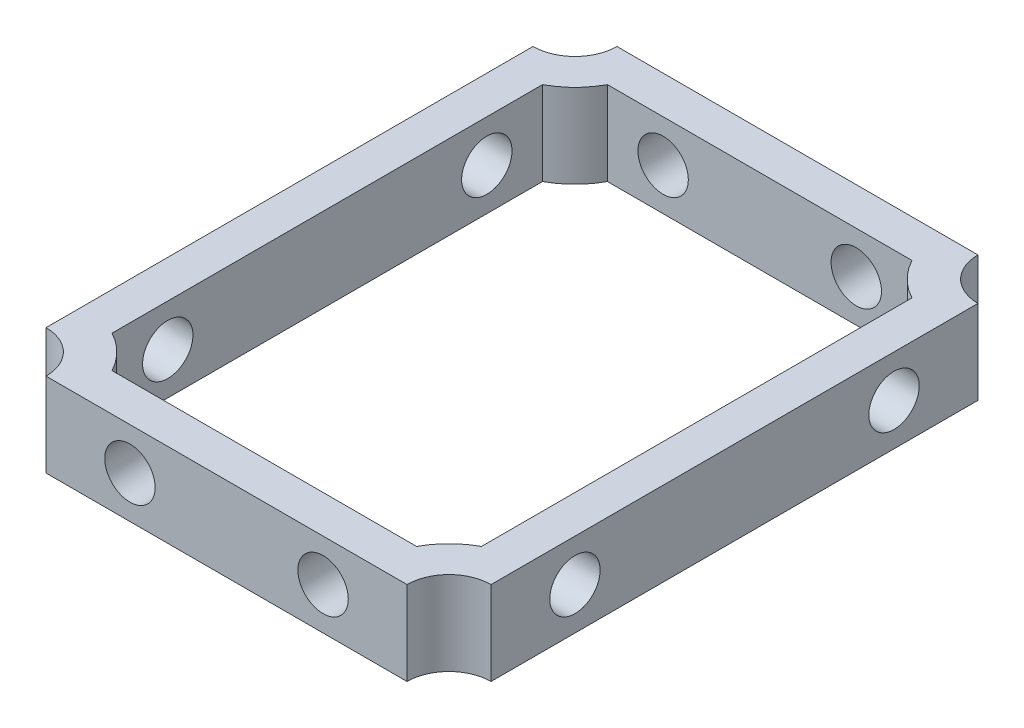
ISO-10303-21;
HEADER;
FILE_DESCRIPTION(('STEP AP214'),'2;1');
FILE_NAME('part.step','',(''),(''),'','','');
FILE_SCHEMA(('AUTOMOTIVE_DESIGN { 1 0 10303 214 1 1 1 1 }'));
ENDSEC;
DATA;
#1=APPLICATION_CONTEXT('core data for automotive mechanical design processes');
#2=APPLICATION_PROTOCOL_DEFINITION('international standard','automotive_design',2000,#1);
#3=PRODUCT_CONTEXT('',#1,'mechanical');
#4=PRODUCT('Part','Part','',(#3));
#5=PRODUCT_RELATED_PRODUCT_CATEGORY('part','',(#4));
#6=PRODUCT_DEFINITION_FORMATION('','',#4);
#7=PRODUCT_DEFINITION_CONTEXT('part definition',#1,'design');
#8=PRODUCT_DEFINITION('design','',#6,#7);
#9=PRODUCT_DEFINITION_SHAPE('','',#8);
#10=(LENGTH_UNIT() NAMED_UNIT(*) SI_UNIT(.MILLI.,.METRE.));
#11=(NAMED_UNIT(*) PLANE_ANGLE_UNIT() SI_UNIT($,.RADIAN.));
#12=(NAMED_UNIT(*) SI_UNIT($,.STERADIAN.) SOLID_ANGLE_UNIT());
#13=UNCERTAINTY_MEASURE_WITH_UNIT(LENGTH_MEASURE(1.E-05),#10,'distance_accuracy_value','');
#14=(GEOMETRIC_REPRESENTATION_CONTEXT(3) GLOBAL_UNCERTAINTY_ASSIGNED_CONTEXT((#13)) GLOBAL_UNIT_ASSIGNED_CONTEXT((#10,
#11,#12)) REPRESENTATION_CONTEXT('',''));
#15=CARTESIAN_POINT('',(0.,0.,0.));
#16=DIRECTION('',(0.,0.,1.));
#17=DIRECTION('',(1.,0.,0.));
#18=AXIS2_PLACEMENT_3D('',#15,#16,#17);
#19=CARTESIAN_POINT('',(-26.5,10.,-34.));
#20=DIRECTION('',(0.,1.,0.));
#21=DIRECTION('',(0.,0.,1.));
#22=AXIS2_PLACEMENT_3D('',#19,#20,#21);
#23=PLANE('',#22);
#24=CARTESIAN_POINT('',(-26.5,10.,-34.));
#25=DIRECTION('',(0.,-1.,0.));
#26=DIRECTION('',(0.,0.,1.));
#27=AXIS2_PLACEMENT_3D('',#24,#25,#26);
#28=CIRCLE('',#27,5.);
#29=CARTESIAN_POINT('',(-21.5,10.,-34.));
#30=VERTEX_POINT('',#29);
#31=CARTESIAN_POINT('',(-26.5,10.,-29.));
#32=VERTEX_POINT('',#31);
#33=EDGE_CURVE('E251',#30,#32,#28,.T.);
#34=ORIENTED_EDGE('',*,*,#33,.T.);
#35=DIRECTION('',(0.,0.,1.));
#36=VECTOR('',#35,1.);
#37=CARTESIAN_POINT('',(-26.5,10.,-29.));
#38=LINE('',#37,#36);
#39=CARTESIAN_POINT('',(-26.5,10.,29.));
#40=VERTEX_POINT('',#39);
#41=EDGE_CURVE('E255',#32,#40,#38,.T.);
#42=ORIENTED_EDGE('',*,*,#41,.T.);
#43=CARTESIAN_POINT('',(-26.5,10.,34.));
#44=DIRECTION('',(0.,-1.,0.));
#45=DIRECTION('',(0.,0.,1.));
#46=AXIS2_PLACEMENT_3D('',#43,#44,#45);
#47=CIRCLE('',#46,5.);
#48=CARTESIAN_POINT('',(-21.5,10.,34.));
#49=VERTEX_POINT('',#48);
#50=EDGE_CURVE('E259',#40,#49,#47,.T.);
#51=ORIENTED_EDGE('',*,*,#50,.T.);
#52=DIRECTION('',(1.,0.,0.));
#53=VECTOR('',#52,1.);
#54=CARTESIAN_POINT('',(-21.5,10.,34.));
#55=LINE('',#54,#53);
#56=CARTESIAN_POINT('',(21.5,10.,34.));
#57=VERTEX_POINT('',#56);
#58=EDGE_CURVE('E262',#49,#57,#55,.T.);
#59=ORIENTED_EDGE('',*,*,#58,.T.);
#60=CARTESIAN_POINT('',(26.5,10.,34.));
#61=DIRECTION('',(0.,-1.,0.));
#62=DIRECTION('',(0.,0.,1.));
#63=AXIS2_PLACEMENT_3D('',#60,#61,#62);
#64=CIRCLE('',#63,5.);
#65=CARTESIAN_POINT('',(26.5,10.,29.));
#66=VERTEX_POINT('',#65);
#67=EDGE_CURVE('E265',#57,#66,#64,.T.);
#68=ORIENTED_EDGE('',*,*,#67,.T.);
#69=DIRECTION('',(0.,0.,-1.));
#70=VECTOR('',#69,1.);
#71=CARTESIAN_POINT('',(26.5,10.,-29.));
#72=LINE('',#71,#70);
#73=CARTESIAN_POINT('',(26.5,10.,-29.));
#74=VERTEX_POINT('',#73);
#75=EDGE_CURVE('E268',#66,#74,#72,.T.);
#76=ORIENTED_EDGE('',*,*,#75,.T.);
#77=CARTESIAN_POINT('',(26.5,10.,-34.));
#78=DIRECTION('',(0.,-1.,0.));
#79=DIRECTION('',(0.,0.,1.));
#80=AXIS2_PLACEMENT_3D('',#77,#78,#79);
#81=CIRCLE('',#80,5.);
#82=CARTESIAN_POINT('',(21.5,10.,-34.));
#83=VERTEX_POINT('',#82);
#84=EDGE_CURVE('E271',#74,#83,#81,.T.);
#85=ORIENTED_EDGE('',*,*,#84,.T.);
#86=DIRECTION('',(-1.,0.,0.));
#87=VECTOR('',#86,1.);
#88=CARTESIAN_POINT('',(-21.5,10.,-34.));
#89=LINE('',#88,#87);
#90=EDGE_CURVE('E274',#83,#30,#89,.T.);
#91=ORIENTED_EDGE('',*,*,#90,.T.);
#92=EDGE_LOOP('',(#34,#42,#51,#59,#68,#76,#85,#91));
#93=FACE_BOUND('',#92,.T.);
#94=DIRECTION('',(0.,0.,1.));
#95=VECTOR('',#94,1.);
#96=CARTESIAN_POINT('',(-22.,10.,-25.6333997346592));
#97=LINE('',#96,#95);
#98=CARTESIAN_POINT('',(-22.,10.,-25.6333997346592));
#99=VERTEX_POINT('',#98);
#100=CARTESIAN_POINT('',(-22.,10.,25.6333997346592));
#101=VERTEX_POINT('',#100);
#102=EDGE_CURVE('E169',#99,#101,#97,.T.);
#103=ORIENTED_EDGE('',*,*,#102,.F.);
#104=CARTESIAN_POINT('',(-26.5,10.,-34.));
#105=DIRECTION('',(0.,-1.,0.));
#106=DIRECTION('',(0.,0.,1.));
#107=AXIS2_PLACEMENT_3D('',#104,#105,#106);
#108=CIRCLE('',#107,9.5);
#109=CARTESIAN_POINT('',(-18.1333997346592,10.,-29.5));
#110=VERTEX_POINT('',#109);
#111=EDGE_CURVE('E160',#110,#99,#108,.T.);
#112=ORIENTED_EDGE('',*,*,#111,.F.);
#113=DIRECTION('',(-1.,0.,0.));
#114=VECTOR('',#113,1.);
#115=CARTESIAN_POINT('',(-18.1333997346592,10.,-29.5));
#116=LINE('',#115,#114);
#117=CARTESIAN_POINT('',(18.1333997346592,10.,-29.5));
#118=VERTEX_POINT('',#117);
#119=EDGE_CURVE('E202',#118,#110,#116,.T.);
#120=ORIENTED_EDGE('',*,*,#119,.F.);
#121=CARTESIAN_POINT('',(26.5,10.,-34.));
#122=DIRECTION('',(0.,-1.,0.));
#123=DIRECTION('',(0.,0.,1.));
#124=AXIS2_PLACEMENT_3D('',#121,#122,#123);
#125=CIRCLE('',#124,9.5);
#126=CARTESIAN_POINT('',(22.,10.,-25.6333997346592));
#127=VERTEX_POINT('',#126);
#128=EDGE_CURVE('E199',#127,#118,#125,.T.);
#129=ORIENTED_EDGE('',*,*,#128,.F.);
#130=DIRECTION('',(0.,0.,-1.));
#131=VECTOR('',#130,1.);
#132=CARTESIAN_POINT('',(22.,10.,-25.6333997346592));
#133=LINE('',#132,#131);
#134=CARTESIAN_POINT('',(22.,10.,25.6333997346592));
#135=VERTEX_POINT('',#134);
#136=EDGE_CURVE('E196',#135,#127,#133,.T.);
#137=ORIENTED_EDGE('',*,*,#136,.F.);
#138=CARTESIAN_POINT('',(26.5,10.,34.));
#139=DIRECTION('',(0.,-1.,0.));
#140=DIRECTION('',(0.,0.,1.));
#141=AXIS2_PLACEMENT_3D('',#138,#139,#140);
#142=CIRCLE('',#141,9.5);
#143=CARTESIAN_POINT('',(18.1333997346592,10.,29.5));
#144=VERTEX_POINT('',#143);
#145=EDGE_CURVE('E193',#144,#135,#142,.T.);
#146=ORIENTED_EDGE('',*,*,#145,.F.);
#147=DIRECTION('',(1.,0.,0.));
#148=VECTOR('',#147,1.);
#149=CARTESIAN_POINT('',(-18.1333997346592,10.,29.5));
#150=LINE('',#149,#148);
#151=CARTESIAN_POINT('',(-18.1333997346592,10.,29.5));
#152=VERTEX_POINT('',#151);
#153=EDGE_CURVE('E187',#152,#144,#150,.T.);
#154=ORIENTED_EDGE('',*,*,#153,.F.);
#155=CARTESIAN_POINT('',(-26.5,10.,34.));
#156=DIRECTION('',(0.,-1.,0.));
#157=DIRECTION('',(0.,0.,1.));
#158=AXIS2_PLACEMENT_3D('',#155,#156,#157);
#159=CIRCLE('',#158,9.5);
#160=EDGE_CURVE('E183',#101,#152,#159,.T.);
#161=ORIENTED_EDGE('',*,*,#160,.F.);
#162=EDGE_LOOP('',(#103,#112,#120,#129,#137,#146,#154,#161));
#163=FACE_BOUND('',#162,.T.);
#164=ADVANCED_FACE('F44',(#93,#163),#23,.T.);
#165=CARTESIAN_POINT('',(-26.5,0.,-34.));
#166=DIRECTION('',(0.,1.,0.));
#167=DIRECTION('',(0.,0.,1.));
#168=AXIS2_PLACEMENT_3D('',#165,#166,#167);
#169=PLANE('',#168);
#170=CARTESIAN_POINT('',(-26.5,0.,-34.));
#171=DIRECTION('',(0.,-1.,0.));
#172=DIRECTION('',(0.,0.,1.));
#173=AXIS2_PLACEMENT_3D('',#170,#171,#172);
#174=CIRCLE('',#173,5.);
#175=CARTESIAN_POINT('',(-21.5,0.,-34.));
#176=VERTEX_POINT('',#175);
#177=CARTESIAN_POINT('',(-26.5,0.,-29.));
#178=VERTEX_POINT('',#177);
#179=EDGE_CURVE('E178',#176,#178,#174,.T.);
#180=ORIENTED_EDGE('',*,*,#179,.F.);
#181=DIRECTION('',(-1.,0.,0.));
#182=VECTOR('',#181,1.);
#183=CARTESIAN_POINT('',(-21.5,0.,-34.));
#184=LINE('',#183,#182);
#185=CARTESIAN_POINT('',(21.5,0.,-34.));
#186=VERTEX_POINT('',#185);
#187=EDGE_CURVE('E256',#186,#176,#184,.T.);
#188=ORIENTED_EDGE('',*,*,#187,.F.);
#189=CARTESIAN_POINT('',(26.5,0.,-34.));
#190=DIRECTION('',(0.,-1.,0.));
#191=DIRECTION('',(0.,0.,1.));
#192=AXIS2_PLACEMENT_3D('',#189,#190,#191);
#193=CIRCLE('',#192,5.);
#194=CARTESIAN_POINT('',(26.5,0.,-29.));
#195=VERTEX_POINT('',#194);
#196=EDGE_CURVE('E296',#195,#186,#193,.T.);
#197=ORIENTED_EDGE('',*,*,#196,.F.);
#198=DIRECTION('',(0.,0.,-1.));
#199=VECTOR('',#198,1.);
#200=CARTESIAN_POINT('',(26.5,0.,-29.));
#201=LINE('',#200,#199);
#202=CARTESIAN_POINT('',(26.5,0.,29.));
#203=VERTEX_POINT('',#202);
#204=EDGE_CURVE('E293',#203,#195,#201,.T.);
#205=ORIENTED_EDGE('',*,*,#204,.F.);
#206=CARTESIAN_POINT('',(26.5,0.,34.));
#207=DIRECTION('',(0.,-1.,0.));
#208=DIRECTION('',(0.,0.,1.));
#209=AXIS2_PLACEMENT_3D('',#206,#207,#208);
#210=CIRCLE('',#209,5.);
#211=CARTESIAN_POINT('',(21.5,0.,34.));
#212=VERTEX_POINT('',#211);
#213=EDGE_CURVE('E290',#212,#203,#210,.T.);
#214=ORIENTED_EDGE('',*,*,#213,.F.);
#215=DIRECTION('',(1.,0.,0.));
#216=VECTOR('',#215,1.);
#217=CARTESIAN_POINT('',(-21.5,0.,34.));
#218=LINE('',#217,#216);
#219=CARTESIAN_POINT('',(-21.5,0.,34.));
#220=VERTEX_POINT('',#219);
#221=EDGE_CURVE('E287',#220,#212,#218,.T.);
#222=ORIENTED_EDGE('',*,*,#221,.F.);
#223=CARTESIAN_POINT('',(-26.5,0.,34.));
#224=DIRECTION('',(0.,-1.,0.));
#225=DIRECTION('',(0.,0.,1.));
#226=AXIS2_PLACEMENT_3D('',#223,#224,#225);
#227=CIRCLE('',#226,5.);
#228=CARTESIAN_POINT('',(-26.5,0.,29.));
#229=VERTEX_POINT('',#228);
#230=EDGE_CURVE('E284',#229,#220,#227,.T.);
#231=ORIENTED_EDGE('',*,*,#230,.F.);
#232=DIRECTION('',(0.,0.,1.));
#233=VECTOR('',#232,1.);
#234=CARTESIAN_POINT('',(-26.5,0.,-29.));
#235=LINE('',#234,#233);
#236=EDGE_CURVE('E281',#178,#229,#235,.T.);
#237=ORIENTED_EDGE('',*,*,#236,.F.);
#238=EDGE_LOOP('',(#180,#188,#197,#205,#214,#222,#231,#237));
#239=FACE_BOUND('',#238,.T.);
#240=CARTESIAN_POINT('',(-26.5,0.,-34.));
#241=DIRECTION('',(0.,-1.,0.));
#242=DIRECTION('',(0.,0.,1.));
#243=AXIS2_PLACEMENT_3D('',#240,#241,#242);
#244=CIRCLE('',#243,9.5);
#245=CARTESIAN_POINT('',(-18.1333997346592,0.,-29.5));
#246=VERTEX_POINT('',#245);
#247=CARTESIAN_POINT('',(-22.,0.,-25.6333997346592));
#248=VERTEX_POINT('',#247);
#249=EDGE_CURVE('E70',#246,#248,#244,.T.);
#250=ORIENTED_EDGE('',*,*,#249,.T.);
#251=DIRECTION('',(0.,0.,1.));
#252=VECTOR('',#251,1.);
#253=CARTESIAN_POINT('',(-22.,0.,-25.6333997346592));
#254=LINE('',#253,#252);
#255=CARTESIAN_POINT('',(-22.,0.,25.6333997346592));
#256=VERTEX_POINT('',#255);
#257=EDGE_CURVE('E176',#248,#256,#254,.T.);
#258=ORIENTED_EDGE('',*,*,#257,.T.);
#259=CARTESIAN_POINT('',(-26.5,0.,34.));
#260=DIRECTION('',(0.,-1.,0.));
#261=DIRECTION('',(0.,0.,1.));
#262=AXIS2_PLACEMENT_3D('',#259,#260,#261);
#263=CIRCLE('',#262,9.5);
#264=CARTESIAN_POINT('',(-18.1333997346592,0.,29.5));
#265=VERTEX_POINT('',#264);
#266=EDGE_CURVE('E210',#256,#265,#263,.T.);
#267=ORIENTED_EDGE('',*,*,#266,.T.);
#268=DIRECTION('',(1.,0.,0.));
#269=VECTOR('',#268,1.);
#270=CARTESIAN_POINT('',(-18.1333997346592,0.,29.5));
#271=LINE('',#270,#269);
#272=CARTESIAN_POINT('',(18.1333997346592,0.,29.5));
#273=VERTEX_POINT('',#272);
#274=EDGE_CURVE('E214',#265,#273,#271,.T.);
#275=ORIENTED_EDGE('',*,*,#274,.T.);
#276=CARTESIAN_POINT('',(26.5,0.,34.));
#277=DIRECTION('',(0.,-1.,0.));
#278=DIRECTION('',(0.,0.,1.));
#279=AXIS2_PLACEMENT_3D('',#276,#277,#278);
#280=CIRCLE('',#279,9.5);
#281=CARTESIAN_POINT('',(22.,0.,25.6333997346592));
#282=VERTEX_POINT('',#281);
#283=EDGE_CURVE('E218',#273,#282,#280,.T.);
#284=ORIENTED_EDGE('',*,*,#283,.T.);
#285=DIRECTION('',(0.,0.,-1.));
#286=VECTOR('',#285,1.);
#287=CARTESIAN_POINT('',(22.,0.,-25.6333997346592));
#288=LINE('',#287,#286);
#289=CARTESIAN_POINT('',(22.,0.,-25.6333997346592));
#290=VERTEX_POINT('',#289);
#291=EDGE_CURVE('E222',#282,#290,#288,.T.);
#292=ORIENTED_EDGE('',*,*,#291,.T.);
#293=CARTESIAN_POINT('',(26.5,0.,-34.));
#294=DIRECTION('',(0.,-1.,0.));
#295=DIRECTION('',(0.,0.,1.));
#296=AXIS2_PLACEMENT_3D('',#293,#294,#295);
#297=CIRCLE('',#296,9.5);
#298=CARTESIAN_POINT('',(18.1333997346592,0.,-29.5));
#299=VERTEX_POINT('',#298);
#300=EDGE_CURVE('E226',#290,#299,#297,.T.);
#301=ORIENTED_EDGE('',*,*,#300,.T.);
#302=DIRECTION('',(-1.,0.,0.));
#303=VECTOR('',#302,1.);
#304=CARTESIAN_POINT('',(-18.1333997346592,0.,-29.5));
#305=LINE('',#304,#303);
#306=EDGE_CURVE('E170',#299,#246,#305,.T.);
#307=ORIENTED_EDGE('',*,*,#306,.T.);
#308=EDGE_LOOP('',(#250,#258,#267,#275,#284,#292,#301,#307));
#309=FACE_BOUND('',#308,.T.);
#310=ADVANCED_FACE('F420',(#239,#309),#169,.F.);
#311=CARTESIAN_POINT('',(-26.5,10.,-34.));
#312=DIRECTION('',(0.,-1.,0.));
#313=DIRECTION('',(0.,0.,-1.));
#314=AXIS2_PLACEMENT_3D('',#311,#312,#313);
#315=CYLINDRICAL_SURFACE('',#314,5.);
#316=ORIENTED_EDGE('',*,*,#179,.T.);
#317=DIRECTION('',(0.,-1.,0.));
#318=VECTOR('',#317,1.);
#319=CARTESIAN_POINT('',(-26.5,10.,-29.));
#320=LINE('',#319,#318);
#321=EDGE_CURVE('E11',#32,#178,#320,.T.);
#322=ORIENTED_EDGE('',*,*,#321,.F.);
#323=ORIENTED_EDGE('',*,*,#33,.F.);
#324=DIRECTION('',(0.,-1.,0.));
#325=VECTOR('',#324,1.);
#326=CARTESIAN_POINT('',(-21.5,10.,-34.));
#327=LINE('',#326,#325);
#328=EDGE_CURVE('E277',#30,#176,#327,.T.);
#329=ORIENTED_EDGE('',*,*,#328,.T.);
#330=EDGE_LOOP('',(#316,#322,#323,#329));
#331=FACE_BOUND('',#330,.T.);
#332=ADVANCED_FACE('F46',(#331),#315,.F.);
#333=CARTESIAN_POINT('',(-26.5,10.,-29.));
#334=DIRECTION('',(1.,0.,0.));
#335=DIRECTION('',(0.,0.,-1.));
#336=AXIS2_PLACEMENT_3D('',#333,#334,#335);
#337=PLANE('',#336);
#338=CARTESIAN_POINT('',(-26.5,5.,19.));
#339=DIRECTION('',(1.,0.,0.));
#340=DIRECTION('',(0.,0.,-1.));
#341=AXIS2_PLACEMENT_3D('',#338,#339,#340);
#342=CIRCLE('',#341,3.);
#343=CARTESIAN_POINT('',(-26.5,5.,16.));
#344=VERTEX_POINT('',#343);
#345=EDGE_CURVE('E332',#344,#344,#342,.T.);
#346=ORIENTED_EDGE('',*,*,#345,.T.);
#347=EDGE_LOOP('',(#346));
#348=FACE_BOUND('',#347,.T.);
#349=CARTESIAN_POINT('',(-26.5,5.,-19.));
#350=DIRECTION('',(1.,0.,0.));
#351=DIRECTION('',(0.,0.,-1.));
#352=AXIS2_PLACEMENT_3D('',#349,#350,#351);
#353=CIRCLE('',#352,3.);
#354=CARTESIAN_POINT('',(-26.5,5.,-22.));
#355=VERTEX_POINT('',#354);
#356=EDGE_CURVE('E368',#355,#355,#353,.T.);
#357=ORIENTED_EDGE('',*,*,#356,.T.);
#358=EDGE_LOOP('',(#357));
#359=FACE_BOUND('',#358,.T.);
#360=ORIENTED_EDGE('',*,*,#236,.T.);
#361=DIRECTION('',(0.,-1.,0.));
#362=VECTOR('',#361,1.);
#363=CARTESIAN_POINT('',(-26.5,10.,29.));
#364=LINE('',#363,#362);
#365=EDGE_CURVE('E54',#40,#229,#364,.T.);
#366=ORIENTED_EDGE('',*,*,#365,.F.);
#367=ORIENTED_EDGE('',*,*,#41,.F.);
#368=ORIENTED_EDGE('',*,*,#321,.T.);
#369=EDGE_LOOP('',(#360,#366,#367,#368));
#370=FACE_BOUND('',#369,.T.);
#371=ADVANCED_FACE('F406',(#348,#359,#370),#337,.F.);
#372=CARTESIAN_POINT('',(-26.5,10.,34.));
#373=DIRECTION('',(0.,-1.,0.));
#374=DIRECTION('',(0.,0.,-1.));
#375=AXIS2_PLACEMENT_3D('',#372,#373,#374);
#376=CYLINDRICAL_SURFACE('',#375,5.);
#377=ORIENTED_EDGE('',*,*,#230,.T.);
#378=DIRECTION('',(0.,-1.,0.));
#379=VECTOR('',#378,1.);
#380=CARTESIAN_POINT('',(-21.5,10.,34.));
#381=LINE('',#380,#379);
#382=EDGE_CURVE('E320',#49,#220,#381,.T.);
#383=ORIENTED_EDGE('',*,*,#382,.F.);
#384=ORIENTED_EDGE('',*,*,#50,.F.);
#385=ORIENTED_EDGE('',*,*,#365,.T.);
#386=EDGE_LOOP('',(#377,#383,#384,#385));
#387=FACE_BOUND('',#386,.T.);
#388=ADVANCED_FACE('F409',(#387),#376,.F.);
#389=CARTESIAN_POINT('',(-21.5,10.,34.));
#390=DIRECTION('',(0.,0.,-1.));
#391=DIRECTION('',(-1.,0.,0.));
#392=AXIS2_PLACEMENT_3D('',#389,#390,#391);
#393=PLANE('',#392);
#394=CARTESIAN_POINT('',(11.5,5.,34.));
#395=DIRECTION('',(0.,0.,1.));
#396=DIRECTION('',(1.,0.,0.));
#397=AXIS2_PLACEMENT_3D('',#394,#395,#396);
#398=CIRCLE('',#397,3.);
#399=CARTESIAN_POINT('',(14.5,5.,34.));
#400=VERTEX_POINT('',#399);
#401=EDGE_CURVE('E348',#400,#400,#398,.T.);
#402=ORIENTED_EDGE('',*,*,#401,.F.);
#403=EDGE_LOOP('',(#402));
#404=FACE_BOUND('',#403,.T.);
#405=CARTESIAN_POINT('',(-11.5,5.,34.));
#406=DIRECTION('',(0.,0.,1.));
#407=DIRECTION('',(1.,0.,0.));
#408=AXIS2_PLACEMENT_3D('',#405,#406,#407);
#409=CIRCLE('',#408,3.);
#410=CARTESIAN_POINT('',(-8.49999999999999,5.,34.));
#411=VERTEX_POINT('',#410);
#412=EDGE_CURVE('E354',#411,#411,#409,.T.);
#413=ORIENTED_EDGE('',*,*,#412,.F.);
#414=EDGE_LOOP('',(#413));
#415=FACE_BOUND('',#414,.T.);
#416=ORIENTED_EDGE('',*,*,#221,.T.);
#417=DIRECTION('',(0.,-1.,0.));
#418=VECTOR('',#417,1.);
#419=CARTESIAN_POINT('',(21.5,10.,34.));
#420=LINE('',#419,#418);
#421=EDGE_CURVE('E316',#57,#212,#420,.T.);
#422=ORIENTED_EDGE('',*,*,#421,.F.);
#423=ORIENTED_EDGE('',*,*,#58,.F.);
#424=ORIENTED_EDGE('',*,*,#382,.T.);
#425=EDGE_LOOP('',(#416,#422,#423,#424));
#426=FACE_BOUND('',#425,.T.);
#427=ADVANCED_FACE('F426',(#404,#415,#426),#393,.F.);
#428=CARTESIAN_POINT('',(26.5,10.,34.));
#429=DIRECTION('',(0.,-1.,0.));
#430=DIRECTION('',(0.,0.,-1.));
#431=AXIS2_PLACEMENT_3D('',#428,#429,#430);
#432=CYLINDRICAL_SURFACE('',#431,5.);
#433=ORIENTED_EDGE('',*,*,#213,.T.);
#434=DIRECTION('',(0.,-1.,0.));
#435=VECTOR('',#434,1.);
#436=CARTESIAN_POINT('',(26.5,10.,29.));
#437=LINE('',#436,#435);
#438=EDGE_CURVE('E312',#66,#203,#437,.T.);
#439=ORIENTED_EDGE('',*,*,#438,.F.);
#440=ORIENTED_EDGE('',*,*,#67,.F.);
#441=ORIENTED_EDGE('',*,*,#421,.T.);
#442=EDGE_LOOP('',(#433,#439,#440,#441));
#443=FACE_BOUND('',#442,.T.);
#444=ADVANCED_FACE('F430',(#443),#432,.F.);
#445=CARTESIAN_POINT('',(26.5,10.,-29.));
#446=DIRECTION('',(-1.,0.,0.));
#447=DIRECTION('',(0.,0.,1.));
#448=AXIS2_PLACEMENT_3D('',#445,#446,#447);
#449=PLANE('',#448);
#450=CARTESIAN_POINT('',(26.5,5.,19.));
#451=DIRECTION('',(1.,0.,0.));
#452=DIRECTION('',(0.,0.,-1.));
#453=AXIS2_PLACEMENT_3D('',#450,#451,#452);
#454=CIRCLE('',#453,3.);
#455=CARTESIAN_POINT('',(26.5,5.,16.));
#456=VERTEX_POINT('',#455);
#457=EDGE_CURVE('E372',#456,#456,#454,.T.);
#458=ORIENTED_EDGE('',*,*,#457,.F.);
#459=EDGE_LOOP('',(#458));
#460=FACE_BOUND('',#459,.T.);
#461=CARTESIAN_POINT('',(26.5,5.,-19.));
#462=DIRECTION('',(1.,0.,0.));
#463=DIRECTION('',(0.,0.,-1.));
#464=AXIS2_PLACEMENT_3D('',#461,#462,#463);
#465=CIRCLE('',#464,3.);
#466=CARTESIAN_POINT('',(26.5,5.,-22.));
#467=VERTEX_POINT('',#466);
#468=EDGE_CURVE('E376',#467,#467,#465,.T.);
#469=ORIENTED_EDGE('',*,*,#468,.F.);
#470=EDGE_LOOP('',(#469));
#471=FACE_BOUND('',#470,.T.);
#472=ORIENTED_EDGE('',*,*,#204,.T.);
#473=DIRECTION('',(0.,-1.,0.));
#474=VECTOR('',#473,1.);
#475=CARTESIAN_POINT('',(26.5,10.,-29.));
#476=LINE('',#475,#474);
#477=EDGE_CURVE('E308',#74,#195,#476,.T.);
#478=ORIENTED_EDGE('',*,*,#477,.F.);
#479=ORIENTED_EDGE('',*,*,#75,.F.);
#480=ORIENTED_EDGE('',*,*,#438,.T.);
#481=EDGE_LOOP('',(#472,#478,#479,#480));
#482=FACE_BOUND('',#481,.T.);
#483=ADVANCED_FACE('F448',(#460,#471,#482),#449,.F.);
#484=CARTESIAN_POINT('',(26.5,10.,-34.));
#485=DIRECTION('',(0.,-1.,0.));
#486=DIRECTION('',(0.,0.,-1.));
#487=AXIS2_PLACEMENT_3D('',#484,#485,#486);
#488=CYLINDRICAL_SURFACE('',#487,5.);
#489=ORIENTED_EDGE('',*,*,#196,.T.);
#490=DIRECTION('',(0.,-1.,0.));
#491=VECTOR('',#490,1.);
#492=CARTESIAN_POINT('',(21.5,10.,-34.));
#493=LINE('',#492,#491);
#494=EDGE_CURVE('E304',#83,#186,#493,.T.);
#495=ORIENTED_EDGE('',*,*,#494,.F.);
#496=ORIENTED_EDGE('',*,*,#84,.F.);
#497=ORIENTED_EDGE('',*,*,#477,.T.);
#498=EDGE_LOOP('',(#489,#495,#496,#497));
#499=FACE_BOUND('',#498,.T.);
#500=ADVANCED_FACE('F446',(#499),#488,.F.);
#501=CARTESIAN_POINT('',(-21.5,10.,-34.));
#502=DIRECTION('',(0.,0.,1.));
#503=DIRECTION('',(1.,0.,0.));
#504=AXIS2_PLACEMENT_3D('',#501,#502,#503);
#505=PLANE('',#504);
#506=CARTESIAN_POINT('',(11.5,5.,-34.));
#507=DIRECTION('',(0.,0.,1.));
#508=DIRECTION('',(1.,0.,0.));
#509=AXIS2_PLACEMENT_3D('',#506,#507,#508);
#510=CIRCLE('',#509,3.);
#511=CARTESIAN_POINT('',(14.5,5.,-34.));
#512=VERTEX_POINT('',#511);
#513=EDGE_CURVE('E340',#512,#512,#510,.T.);
#514=ORIENTED_EDGE('',*,*,#513,.T.);
#515=EDGE_LOOP('',(#514));
#516=FACE_BOUND('',#515,.T.);
#517=CARTESIAN_POINT('',(-11.5,5.,-34.));
#518=DIRECTION('',(0.,0.,1.));
#519=DIRECTION('',(1.,0.,0.));
#520=AXIS2_PLACEMENT_3D('',#517,#518,#519);
#521=CIRCLE('',#520,3.);
#522=CARTESIAN_POINT('',(-8.49999999999999,5.,-34.));
#523=VERTEX_POINT('',#522);
#524=EDGE_CURVE('E360',#523,#523,#521,.T.);
#525=ORIENTED_EDGE('',*,*,#524,.T.);
#526=EDGE_LOOP('',(#525));
#527=FACE_BOUND('',#526,.T.);
#528=ORIENTED_EDGE('',*,*,#187,.T.);
#529=ORIENTED_EDGE('',*,*,#328,.F.);
#530=ORIENTED_EDGE('',*,*,#90,.F.);
#531=ORIENTED_EDGE('',*,*,#494,.T.);
#532=EDGE_LOOP('',(#528,#529,#530,#531));
#533=FACE_BOUND('',#532,.T.);
#534=ADVANCED_FACE('F442',(#516,#527,#533),#505,.F.);
#535=CARTESIAN_POINT('',(-26.5,10.,-34.));
#536=DIRECTION('',(0.,-1.,0.));
#537=DIRECTION('',(0.,0.,-1.));
#538=AXIS2_PLACEMENT_3D('',#535,#536,#537);
#539=CYLINDRICAL_SURFACE('',#538,9.5);
#540=ORIENTED_EDGE('',*,*,#249,.F.);
#541=DIRECTION('',(0.,-1.,0.));
#542=VECTOR('',#541,1.);
#543=CARTESIAN_POINT('',(-18.1333997346592,10.,-29.5));
#544=LINE('',#543,#542);
#545=EDGE_CURVE('E164',#110,#246,#544,.T.);
#546=ORIENTED_EDGE('',*,*,#545,.F.);
#547=ORIENTED_EDGE('',*,*,#111,.T.);
#548=DIRECTION('',(0.,-1.,0.));
#549=VECTOR('',#548,1.);
#550=CARTESIAN_POINT('',(-22.,10.,-25.6333997346592));
#551=LINE('',#550,#549);
#552=EDGE_CURVE('E163',#99,#248,#551,.T.);
#553=ORIENTED_EDGE('',*,*,#552,.T.);
#554=EDGE_LOOP('',(#540,#546,#547,#553));
#555=FACE_BOUND('',#554,.T.);
#556=ADVANCED_FACE('F162',(#555),#539,.T.);
#557=CARTESIAN_POINT('',(-22.,10.,-25.6333997346592));
#558=DIRECTION('',(1.,0.,0.));
#559=DIRECTION('',(0.,0.,-1.));
#560=AXIS2_PLACEMENT_3D('',#557,#558,#559);
#561=PLANE('',#560);
#562=CARTESIAN_POINT('',(-22.,5.,19.));
#563=DIRECTION('',(1.,0.,0.));
#564=DIRECTION('',(0.,0.,-1.));
#565=AXIS2_PLACEMENT_3D('',#562,#563,#564);
#566=CIRCLE('',#565,3.);
#567=CARTESIAN_POINT('',(-22.,5.,16.));
#568=VERTEX_POINT('',#567);
#569=EDGE_CURVE('E207',#568,#568,#566,.T.);
#570=ORIENTED_EDGE('',*,*,#569,.F.);
#571=EDGE_LOOP('',(#570));
#572=FACE_BOUND('',#571,.T.);
#573=CARTESIAN_POINT('',(-22.,5.,-19.));
#574=DIRECTION('',(1.,0.,0.));
#575=DIRECTION('',(0.,0.,-1.));
#576=AXIS2_PLACEMENT_3D('',#573,#574,#575);
#577=CIRCLE('',#576,3.);
#578=CARTESIAN_POINT('',(-22.,5.,-22.));
#579=VERTEX_POINT('',#578);
#580=EDGE_CURVE('E331',#579,#579,#577,.T.);
#581=ORIENTED_EDGE('',*,*,#580,.F.);
#582=EDGE_LOOP('',(#581));
#583=FACE_BOUND('',#582,.T.);
#584=ORIENTED_EDGE('',*,*,#257,.F.);
#585=ORIENTED_EDGE('',*,*,#552,.F.);
#586=ORIENTED_EDGE('',*,*,#102,.T.);
#587=DIRECTION('',(0.,-1.,0.));
#588=VECTOR('',#587,1.);
#589=CARTESIAN_POINT('',(-22.,10.,25.6333997346592));
#590=LINE('',#589,#588);
#591=EDGE_CURVE('E179',#101,#256,#590,.T.);
#592=ORIENTED_EDGE('',*,*,#591,.T.);
#593=EDGE_LOOP('',(#584,#585,#586,#592));
#594=FACE_BOUND('',#593,.T.);
#595=ADVANCED_FACE('F173',(#572,#583,#594),#561,.T.);
#596=CARTESIAN_POINT('',(-26.5,10.,34.));
#597=DIRECTION('',(0.,-1.,0.));
#598=DIRECTION('',(0.,0.,-1.));
#599=AXIS2_PLACEMENT_3D('',#596,#597,#598);
#600=CYLINDRICAL_SURFACE('',#599,9.5);
#601=ORIENTED_EDGE('',*,*,#266,.F.);
#602=ORIENTED_EDGE('',*,*,#591,.F.);
#603=ORIENTED_EDGE('',*,*,#160,.T.);
#604=DIRECTION('',(0.,-1.,0.));
#605=VECTOR('',#604,1.);
#606=CARTESIAN_POINT('',(-18.1333997346592,10.,29.5));
#607=LINE('',#606,#605);
#608=EDGE_CURVE('E246',#152,#265,#607,.T.);
#609=ORIENTED_EDGE('',*,*,#608,.T.);
#610=EDGE_LOOP('',(#601,#602,#603,#609));
#611=FACE_BOUND('',#610,.T.);
#612=ADVANCED_FACE('F394',(#611),#600,.T.);
#613=CARTESIAN_POINT('',(-18.1333997346592,10.,29.5));
#614=DIRECTION('',(0.,0.,-1.));
#615=DIRECTION('',(-1.,0.,0.));
#616=AXIS2_PLACEMENT_3D('',#613,#614,#615);
#617=PLANE('',#616);
#618=CARTESIAN_POINT('',(11.5,5.,29.5));
#619=DIRECTION('',(0.,0.,-1.));
#620=DIRECTION('',(-1.,0.,0.));
#621=AXIS2_PLACEMENT_3D('',#618,#619,#620);
#622=CIRCLE('',#621,3.);
#623=CARTESIAN_POINT('',(8.49999999999999,5.,29.5));
#624=VERTEX_POINT('',#623);
#625=EDGE_CURVE('E364',#624,#624,#622,.T.);
#626=ORIENTED_EDGE('',*,*,#625,.F.);
#627=EDGE_LOOP('',(#626));
#628=FACE_BOUND('',#627,.T.);
#629=CARTESIAN_POINT('',(-11.5,5.,29.5));
#630=DIRECTION('',(0.,0.,-1.));
#631=DIRECTION('',(-1.,0.,0.));
#632=AXIS2_PLACEMENT_3D('',#629,#630,#631);
#633=CIRCLE('',#632,3.);
#634=CARTESIAN_POINT('',(-14.5,5.,29.5));
#635=VERTEX_POINT('',#634);
#636=EDGE_CURVE('E339',#635,#635,#633,.T.);
#637=ORIENTED_EDGE('',*,*,#636,.F.);
#638=EDGE_LOOP('',(#637));
#639=FACE_BOUND('',#638,.T.);
#640=ORIENTED_EDGE('',*,*,#274,.F.);
#641=ORIENTED_EDGE('',*,*,#608,.F.);
#642=ORIENTED_EDGE('',*,*,#153,.T.);
#643=DIRECTION('',(0.,-1.,0.));
#644=VECTOR('',#643,1.);
#645=CARTESIAN_POINT('',(18.1333997346592,10.,29.5));
#646=LINE('',#645,#644);
#647=EDGE_CURVE('E243',#144,#273,#646,.T.);
#648=ORIENTED_EDGE('',*,*,#647,.T.);
#649=EDGE_LOOP('',(#640,#641,#642,#648));
#650=FACE_BOUND('',#649,.T.);
#651=ADVANCED_FACE('F538',(#628,#639,#650),#617,.T.);
#652=CARTESIAN_POINT('',(26.5,10.,34.));
#653=DIRECTION('',(0.,-1.,0.));
#654=DIRECTION('',(0.,0.,-1.));
#655=AXIS2_PLACEMENT_3D('',#652,#653,#654);
#656=CYLINDRICAL_SURFACE('',#655,9.5);
#657=ORIENTED_EDGE('',*,*,#283,.F.);
#658=ORIENTED_EDGE('',*,*,#647,.F.);
#659=ORIENTED_EDGE('',*,*,#145,.T.);
#660=DIRECTION('',(0.,-1.,0.));
#661=VECTOR('',#660,1.);
#662=CARTESIAN_POINT('',(22.,10.,25.6333997346592));
#663=LINE('',#662,#661);
#664=EDGE_CURVE('E240',#135,#282,#663,.T.);
#665=ORIENTED_EDGE('',*,*,#664,.T.);
#666=EDGE_LOOP('',(#657,#658,#659,#665));
#667=FACE_BOUND('',#666,.T.);
#668=ADVANCED_FACE('F545',(#667),#656,.T.);
#669=CARTESIAN_POINT('',(22.,10.,-25.6333997346592));
#670=DIRECTION('',(-1.,0.,0.));
#671=DIRECTION('',(0.,0.,1.));
#672=AXIS2_PLACEMENT_3D('',#669,#670,#671);
#673=PLANE('',#672);
#674=CARTESIAN_POINT('',(22.,5.,19.));
#675=DIRECTION('',(-1.,0.,0.));
#676=DIRECTION('',(0.,0.,1.));
#677=AXIS2_PLACEMENT_3D('',#674,#675,#676);
#678=CIRCLE('',#677,3.);
#679=CARTESIAN_POINT('',(22.,5.,22.));
#680=VERTEX_POINT('',#679);
#681=EDGE_CURVE('E333',#680,#680,#678,.T.);
#682=ORIENTED_EDGE('',*,*,#681,.F.);
#683=EDGE_LOOP('',(#682));
#684=FACE_BOUND('',#683,.T.);
#685=CARTESIAN_POINT('',(22.,5.,-19.));
#686=DIRECTION('',(-1.,0.,0.));
#687=DIRECTION('',(0.,0.,1.));
#688=AXIS2_PLACEMENT_3D('',#685,#686,#687);
#689=CIRCLE('',#688,3.);
#690=CARTESIAN_POINT('',(22.,5.,-16.));
#691=VERTEX_POINT('',#690);
#692=EDGE_CURVE('E327',#691,#691,#689,.T.);
#693=ORIENTED_EDGE('',*,*,#692,.F.);
#694=EDGE_LOOP('',(#693));
#695=FACE_BOUND('',#694,.T.);
#696=ORIENTED_EDGE('',*,*,#291,.F.);
#697=ORIENTED_EDGE('',*,*,#664,.F.);
#698=ORIENTED_EDGE('',*,*,#136,.T.);
#699=DIRECTION('',(0.,-1.,0.));
#700=VECTOR('',#699,1.);
#701=CARTESIAN_POINT('',(22.,10.,-25.6333997346592));
#702=LINE('',#701,#700);
#703=EDGE_CURVE('E237',#127,#290,#702,.T.);
#704=ORIENTED_EDGE('',*,*,#703,.T.);
#705=EDGE_LOOP('',(#696,#697,#698,#704));
#706=FACE_BOUND('',#705,.T.);
#707=ADVANCED_FACE('F549',(#684,#695,#706),#673,.T.);
#708=CARTESIAN_POINT('',(26.5,10.,-34.));
#709=DIRECTION('',(0.,-1.,0.));
#710=DIRECTION('',(0.,0.,-1.));
#711=AXIS2_PLACEMENT_3D('',#708,#709,#710);
#712=CYLINDRICAL_SURFACE('',#711,9.5);
#713=ORIENTED_EDGE('',*,*,#300,.F.);
#714=ORIENTED_EDGE('',*,*,#703,.F.);
#715=ORIENTED_EDGE('',*,*,#128,.T.);
#716=DIRECTION('',(0.,-1.,0.));
#717=VECTOR('',#716,1.);
#718=CARTESIAN_POINT('',(18.1333997346592,10.,-29.5));
#719=LINE('',#718,#717);
#720=EDGE_CURVE('E62',#118,#299,#719,.T.);
#721=ORIENTED_EDGE('',*,*,#720,.T.);
#722=EDGE_LOOP('',(#713,#714,#715,#721));
#723=FACE_BOUND('',#722,.T.);
#724=ADVANCED_FACE('F556',(#723),#712,.T.);
#725=CARTESIAN_POINT('',(-18.1333997346592,10.,-29.5));
#726=DIRECTION('',(0.,0.,1.));
#727=DIRECTION('',(1.,0.,0.));
#728=AXIS2_PLACEMENT_3D('',#725,#726,#727);
#729=PLANE('',#728);
#730=CARTESIAN_POINT('',(11.5,5.,-29.5));
#731=DIRECTION('',(0.,0.,1.));
#732=DIRECTION('',(1.,0.,0.));
#733=AXIS2_PLACEMENT_3D('',#730,#731,#732);
#734=CIRCLE('',#733,3.);
#735=CARTESIAN_POINT('',(14.5,5.,-29.5));
#736=VERTEX_POINT('',#735);
#737=EDGE_CURVE('E48',#736,#736,#734,.T.);
#738=ORIENTED_EDGE('',*,*,#737,.F.);
#739=EDGE_LOOP('',(#738));
#740=FACE_BOUND('',#739,.T.);
#741=CARTESIAN_POINT('',(-11.5,5.,-29.5));
#742=DIRECTION('',(0.,0.,1.));
#743=DIRECTION('',(1.,0.,0.));
#744=AXIS2_PLACEMENT_3D('',#741,#742,#743);
#745=CIRCLE('',#744,3.);
#746=CARTESIAN_POINT('',(-8.49999999999999,5.,-29.5));
#747=VERTEX_POINT('',#746);
#748=EDGE_CURVE('E336',#747,#747,#745,.T.);
#749=ORIENTED_EDGE('',*,*,#748,.F.);
#750=EDGE_LOOP('',(#749));
#751=FACE_BOUND('',#750,.T.);
#752=ORIENTED_EDGE('',*,*,#306,.F.);
#753=ORIENTED_EDGE('',*,*,#720,.F.);
#754=ORIENTED_EDGE('',*,*,#119,.T.);
#755=ORIENTED_EDGE('',*,*,#545,.T.);
#756=EDGE_LOOP('',(#752,#753,#754,#755));
#757=FACE_BOUND('',#756,.T.);
#758=ADVANCED_FACE('F559',(#740,#751,#757),#729,.T.);
#759=CARTESIAN_POINT('',(-26.5,5.,-19.));
#760=DIRECTION('',(1.,0.,0.));
#761=DIRECTION('',(0.,0.,-1.));
#762=AXIS2_PLACEMENT_3D('',#759,#760,#761);
#763=CYLINDRICAL_SURFACE('',#762,3.);
#764=ORIENTED_EDGE('',*,*,#692,.T.);
#765=EDGE_LOOP('',(#764));
#766=FACE_BOUND('',#765,.T.);
#767=ORIENTED_EDGE('',*,*,#468,.T.);
#768=EDGE_LOOP('',(#767));
#769=FACE_BOUND('',#768,.T.);
#770=ADVANCED_FACE('F403',(#766,#769),#763,.F.);
#771=CARTESIAN_POINT('',(-26.5,5.,19.));
#772=DIRECTION('',(1.,0.,0.));
#773=DIRECTION('',(0.,0.,-1.));
#774=AXIS2_PLACEMENT_3D('',#771,#772,#773);
#775=CYLINDRICAL_SURFACE('',#774,3.);
#776=ORIENTED_EDGE('',*,*,#681,.T.);
#777=EDGE_LOOP('',(#776));
#778=FACE_BOUND('',#777,.T.);
#779=ORIENTED_EDGE('',*,*,#457,.T.);
#780=EDGE_LOOP('',(#779));
#781=FACE_BOUND('',#780,.T.);
#782=ADVANCED_FACE('F401',(#778,#781),#775,.F.);
#783=ORIENTED_EDGE('',*,*,#580,.T.);
#784=EDGE_LOOP('',(#783));
#785=FACE_BOUND('',#784,.T.);
#786=ORIENTED_EDGE('',*,*,#356,.F.);
#787=EDGE_LOOP('',(#786));
#788=FACE_BOUND('',#787,.T.);
#789=ADVANCED_FACE('F398',(#785,#788),#763,.F.);
#790=ORIENTED_EDGE('',*,*,#569,.T.);
#791=EDGE_LOOP('',(#790));
#792=FACE_BOUND('',#791,.T.);
#793=ORIENTED_EDGE('',*,*,#345,.F.);
#794=EDGE_LOOP('',(#793));
#795=FACE_BOUND('',#794,.T.);
#796=ADVANCED_FACE('F389',(#792,#795),#775,.F.);
#797=CARTESIAN_POINT('',(-11.5,5.,-34.));
#798=DIRECTION('',(0.,0.,1.));
#799=DIRECTION('',(1.,0.,0.));
#800=AXIS2_PLACEMENT_3D('',#797,#798,#799);
#801=CYLINDRICAL_SURFACE('',#800,3.);
#802=ORIENTED_EDGE('',*,*,#748,.T.);
#803=EDGE_LOOP('',(#802));
#804=FACE_BOUND('',#803,.T.);
#805=ORIENTED_EDGE('',*,*,#524,.F.);
#806=EDGE_LOOP('',(#805));
#807=FACE_BOUND('',#806,.T.);
#808=ADVANCED_FACE('F477',(#804,#807),#801,.F.);
#809=CARTESIAN_POINT('',(11.5,5.,-34.));
#810=DIRECTION('',(0.,0.,1.));
#811=DIRECTION('',(1.,0.,0.));
#812=AXIS2_PLACEMENT_3D('',#809,#810,#811);
#813=CYLINDRICAL_SURFACE('',#812,3.);
#814=ORIENTED_EDGE('',*,*,#737,.T.);
#815=EDGE_LOOP('',(#814));
#816=FACE_BOUND('',#815,.T.);
#817=ORIENTED_EDGE('',*,*,#513,.F.);
#818=EDGE_LOOP('',(#817));
#819=FACE_BOUND('',#818,.T.);
#820=ADVANCED_FACE('F479',(#816,#819),#813,.F.);
#821=ORIENTED_EDGE('',*,*,#636,.T.);
#822=EDGE_LOOP('',(#821));
#823=FACE_BOUND('',#822,.T.);
#824=ORIENTED_EDGE('',*,*,#412,.T.);
#825=EDGE_LOOP('',(#824));
#826=FACE_BOUND('',#825,.T.);
#827=ADVANCED_FACE('F481',(#823,#826),#801,.F.);
#828=ORIENTED_EDGE('',*,*,#625,.T.);
#829=EDGE_LOOP('',(#828));
#830=FACE_BOUND('',#829,.T.);
#831=ORIENTED_EDGE('',*,*,#401,.T.);
#832=EDGE_LOOP('',(#831));
#833=FACE_BOUND('',#832,.T.);
#834=ADVANCED_FACE('F488',(#830,#833),#813,.F.);
#835=CLOSED_SHELL('',(#164,#310,#332,#371,#388,#427,#444,#483,#500,#534,#556,#595,#612,#651,
#668,#707,#724,#758,#770,#782,#789,#796,#808,#820,#827,#834));
#836=MANIFOLD_SOLID_BREP('B2',#835);
#837=ADVANCED_BREP_SHAPE_REPRESENTATION('',(#18,#836),#14);
#838=SHAPE_DEFINITION_REPRESENTATION(#9,#837);
ENDSEC;
END-ISO-10303-21;
